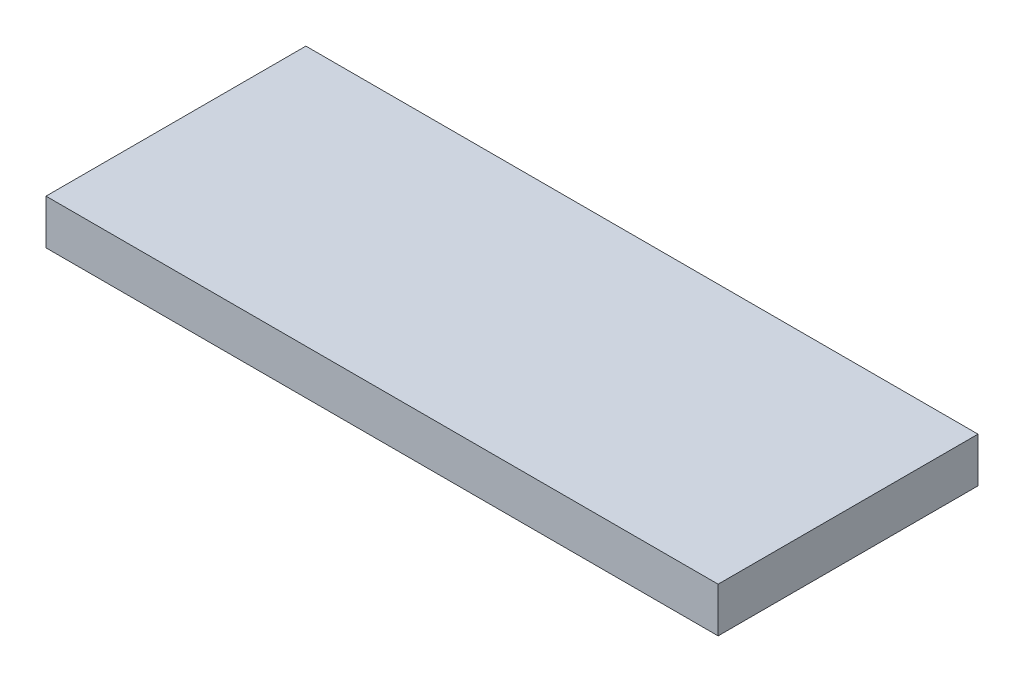
ISO-10303-21;
HEADER;
FILE_DESCRIPTION(('STEP AP214'),'2;1');
FILE_NAME('part.step','',(''),(''),'','','');
FILE_SCHEMA(('AUTOMOTIVE_DESIGN { 1 0 10303 214 1 1 1 1 }'));
ENDSEC;
DATA;
#1=APPLICATION_CONTEXT('core data for automotive mechanical design processes');
#2=APPLICATION_PROTOCOL_DEFINITION('international standard','automotive_design',2000,#1);
#3=PRODUCT_CONTEXT('',#1,'mechanical');
#4=PRODUCT('Part','Part','',(#3));
#5=PRODUCT_RELATED_PRODUCT_CATEGORY('part','',(#4));
#6=PRODUCT_DEFINITION_FORMATION('','',#4);
#7=PRODUCT_DEFINITION_CONTEXT('part definition',#1,'design');
#8=PRODUCT_DEFINITION('design','',#6,#7);
#9=PRODUCT_DEFINITION_SHAPE('','',#8);
#10=(LENGTH_UNIT() NAMED_UNIT(*) SI_UNIT(.MILLI.,.METRE.));
#11=(NAMED_UNIT(*) PLANE_ANGLE_UNIT() SI_UNIT($,.RADIAN.));
#12=(NAMED_UNIT(*) SI_UNIT($,.STERADIAN.) SOLID_ANGLE_UNIT());
#13=UNCERTAINTY_MEASURE_WITH_UNIT(LENGTH_MEASURE(1.E-05),#10,'distance_accuracy_value','');
#14=(GEOMETRIC_REPRESENTATION_CONTEXT(3) GLOBAL_UNCERTAINTY_ASSIGNED_CONTEXT((#13)) GLOBAL_UNIT_ASSIGNED_CONTEXT((#10,
#11,#12)) REPRESENTATION_CONTEXT('',''));
#15=CARTESIAN_POINT('',(0.,0.,0.));
#16=DIRECTION('',(0.,0.,1.));
#17=DIRECTION('',(1.,0.,0.));
#18=AXIS2_PLACEMENT_3D('',#15,#16,#17);
#19=CARTESIAN_POINT('',(0.,5.,0.));
#20=DIRECTION('',(1.,0.,0.));
#21=DIRECTION('',(0.,0.,-1.));
#22=AXIS2_PLACEMENT_3D('',#19,#20,#21);
#23=PLANE('',#22);
#24=DIRECTION('',(0.,0.,1.));
#25=VECTOR('',#24,1.);
#26=CARTESIAN_POINT('',(0.,0.,0.));
#27=LINE('',#26,#25);
#28=CARTESIAN_POINT('',(0.,0.,-29.));
#29=VERTEX_POINT('',#28);
#30=CARTESIAN_POINT('',(0.,0.,0.));
#31=VERTEX_POINT('',#30);
#32=EDGE_CURVE('E113',#29,#31,#27,.T.);
#33=ORIENTED_EDGE('',*,*,#32,.T.);
#34=DIRECTION('',(0.,-1.,0.));
#35=VECTOR('',#34,1.);
#36=CARTESIAN_POINT('',(0.,5.,0.));
#37=LINE('',#36,#35);
#38=CARTESIAN_POINT('',(0.,5.,0.));
#39=VERTEX_POINT('',#38);
#40=EDGE_CURVE('E11',#39,#31,#37,.T.);
#41=ORIENTED_EDGE('',*,*,#40,.F.);
#42=DIRECTION('',(0.,0.,1.));
#43=VECTOR('',#42,1.);
#44=CARTESIAN_POINT('',(0.,5.,0.));
#45=LINE('',#44,#43);
#46=CARTESIAN_POINT('',(0.,5.,-29.));
#47=VERTEX_POINT('',#46);
#48=EDGE_CURVE('E97',#47,#39,#45,.T.);
#49=ORIENTED_EDGE('',*,*,#48,.F.);
#50=DIRECTION('',(0.,-1.,0.));
#51=VECTOR('',#50,1.);
#52=CARTESIAN_POINT('',(0.,5.,-29.));
#53=LINE('',#52,#51);
#54=EDGE_CURVE('E109',#47,#29,#53,.T.);
#55=ORIENTED_EDGE('',*,*,#54,.T.);
#56=EDGE_LOOP('',(#33,#41,#49,#55));
#57=FACE_BOUND('',#56,.T.);
#58=ADVANCED_FACE('F45',(#57),#23,.F.);
#59=CARTESIAN_POINT('',(0.,5.,0.));
#60=DIRECTION('',(0.,0.,-1.));
#61=DIRECTION('',(-1.,0.,0.));
#62=AXIS2_PLACEMENT_3D('',#59,#60,#61);
#63=PLANE('',#62);
#64=DIRECTION('',(1.,0.,0.));
#65=VECTOR('',#64,1.);
#66=CARTESIAN_POINT('',(0.,0.,0.));
#67=LINE('',#66,#65);
#68=CARTESIAN_POINT('',(75.,0.,0.));
#69=VERTEX_POINT('',#68);
#70=EDGE_CURVE('E102',#31,#69,#67,.T.);
#71=ORIENTED_EDGE('',*,*,#70,.T.);
#72=DIRECTION('',(0.,-1.,0.));
#73=VECTOR('',#72,1.);
#74=CARTESIAN_POINT('',(75.,5.,0.));
#75=LINE('',#74,#73);
#76=CARTESIAN_POINT('',(75.,5.,0.));
#77=VERTEX_POINT('',#76);
#78=EDGE_CURVE('E54',#77,#69,#75,.T.);
#79=ORIENTED_EDGE('',*,*,#78,.F.);
#80=DIRECTION('',(1.,0.,0.));
#81=VECTOR('',#80,1.);
#82=CARTESIAN_POINT('',(0.,5.,0.));
#83=LINE('',#82,#81);
#84=EDGE_CURVE('E92',#39,#77,#83,.T.);
#85=ORIENTED_EDGE('',*,*,#84,.F.);
#86=ORIENTED_EDGE('',*,*,#40,.T.);
#87=EDGE_LOOP('',(#71,#79,#85,#86));
#88=FACE_BOUND('',#87,.T.);
#89=ADVANCED_FACE('F101',(#88),#63,.F.);
#90=CARTESIAN_POINT('',(75.,5.,0.));
#91=DIRECTION('',(-1.,0.,0.));
#92=DIRECTION('',(0.,0.,1.));
#93=AXIS2_PLACEMENT_3D('',#90,#91,#92);
#94=PLANE('',#93);
#95=DIRECTION('',(0.,0.,-1.));
#96=VECTOR('',#95,1.);
#97=CARTESIAN_POINT('',(75.,0.,0.));
#98=LINE('',#97,#96);
#99=CARTESIAN_POINT('',(75.,0.,-29.));
#100=VERTEX_POINT('',#99);
#101=EDGE_CURVE('E79',#69,#100,#98,.T.);
#102=ORIENTED_EDGE('',*,*,#101,.T.);
#103=DIRECTION('',(0.,-1.,0.));
#104=VECTOR('',#103,1.);
#105=CARTESIAN_POINT('',(75.,5.,-29.));
#106=LINE('',#105,#104);
#107=CARTESIAN_POINT('',(75.,5.,-29.));
#108=VERTEX_POINT('',#107);
#109=EDGE_CURVE('E104',#108,#100,#106,.T.);
#110=ORIENTED_EDGE('',*,*,#109,.F.);
#111=DIRECTION('',(0.,0.,-1.));
#112=VECTOR('',#111,1.);
#113=CARTESIAN_POINT('',(75.,5.,0.));
#114=LINE('',#113,#112);
#115=EDGE_CURVE('E95',#77,#108,#114,.T.);
#116=ORIENTED_EDGE('',*,*,#115,.F.);
#117=ORIENTED_EDGE('',*,*,#78,.T.);
#118=EDGE_LOOP('',(#102,#110,#116,#117));
#119=FACE_BOUND('',#118,.T.);
#120=ADVANCED_FACE('F105',(#119),#94,.F.);
#121=CARTESIAN_POINT('',(0.,5.,-29.));
#122=DIRECTION('',(0.,0.,1.));
#123=DIRECTION('',(1.,0.,0.));
#124=AXIS2_PLACEMENT_3D('',#121,#122,#123);
#125=PLANE('',#124);
#126=DIRECTION('',(-1.,0.,0.));
#127=VECTOR('',#126,1.);
#128=CARTESIAN_POINT('',(0.,0.,-29.));
#129=LINE('',#128,#127);
#130=EDGE_CURVE('E85',#100,#29,#129,.T.);
#131=ORIENTED_EDGE('',*,*,#130,.T.);
#132=ORIENTED_EDGE('',*,*,#54,.F.);
#133=DIRECTION('',(-1.,0.,0.));
#134=VECTOR('',#133,1.);
#135=CARTESIAN_POINT('',(0.,5.,-29.));
#136=LINE('',#135,#134);
#137=EDGE_CURVE('E62',#108,#47,#136,.T.);
#138=ORIENTED_EDGE('',*,*,#137,.F.);
#139=ORIENTED_EDGE('',*,*,#109,.T.);
#140=EDGE_LOOP('',(#131,#132,#138,#139));
#141=FACE_BOUND('',#140,.T.);
#142=ADVANCED_FACE('F126',(#141),#125,.F.);
#143=CARTESIAN_POINT('',(0.,5.,0.));
#144=DIRECTION('',(0.,-1.,0.));
#145=DIRECTION('',(0.,0.,-1.));
#146=AXIS2_PLACEMENT_3D('',#143,#144,#145);
#147=PLANE('',#146);
#148=ORIENTED_EDGE('',*,*,#48,.T.);
#149=ORIENTED_EDGE('',*,*,#84,.T.);
#150=ORIENTED_EDGE('',*,*,#115,.T.);
#151=ORIENTED_EDGE('',*,*,#137,.T.);
#152=EDGE_LOOP('',(#148,#149,#150,#151));
#153=FACE_BOUND('',#152,.T.);
#154=ADVANCED_FACE('F93',(#153),#147,.F.);
#155=CARTESIAN_POINT('',(0.,0.,0.));
#156=DIRECTION('',(0.,-1.,0.));
#157=DIRECTION('',(0.,0.,-1.));
#158=AXIS2_PLACEMENT_3D('',#155,#156,#157);
#159=PLANE('',#158);
#160=ORIENTED_EDGE('',*,*,#32,.F.);
#161=ORIENTED_EDGE('',*,*,#130,.F.);
#162=ORIENTED_EDGE('',*,*,#101,.F.);
#163=ORIENTED_EDGE('',*,*,#70,.F.);
#164=EDGE_LOOP('',(#160,#161,#162,#163));
#165=FACE_BOUND('',#164,.T.);
#166=ADVANCED_FACE('F129',(#165),#159,.T.);
#167=CLOSED_SHELL('',(#58,#89,#120,#142,#154,#166));
#168=MANIFOLD_SOLID_BREP('B2',#167);
#169=ADVANCED_BREP_SHAPE_REPRESENTATION('',(#18,#168),#14);
#170=SHAPE_DEFINITION_REPRESENTATION(#9,#169);
ENDSEC;
END-ISO-10303-21;
